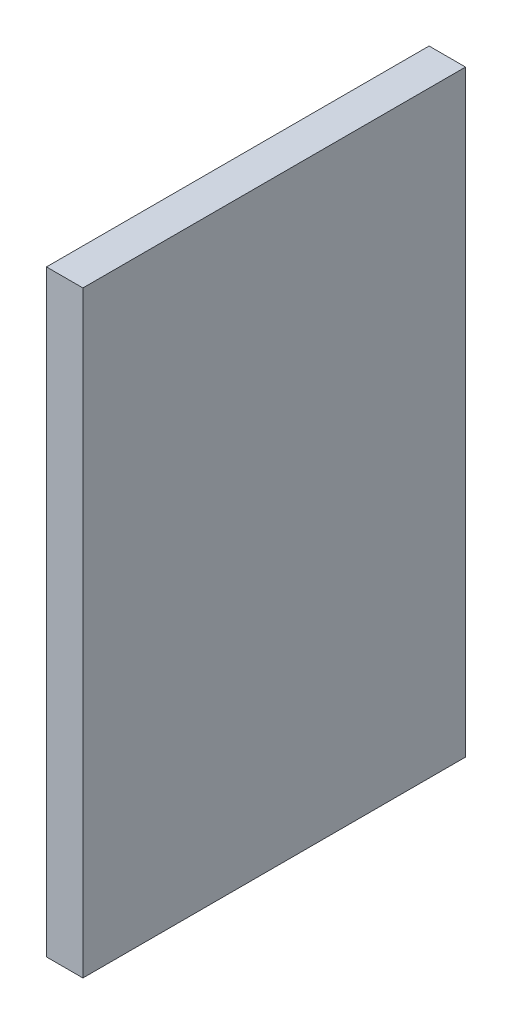
ISO-10303-21;
HEADER;
FILE_DESCRIPTION(('STEP AP214'),'2;1');
FILE_NAME('part.step','',(''),(''),'','','');
FILE_SCHEMA(('AUTOMOTIVE_DESIGN { 1 0 10303 214 1 1 1 1 }'));
ENDSEC;
DATA;
#1=APPLICATION_CONTEXT('core data for automotive mechanical design processes');
#2=APPLICATION_PROTOCOL_DEFINITION('international standard','automotive_design',2000,#1);
#3=PRODUCT_CONTEXT('',#1,'mechanical');
#4=PRODUCT('Part','Part','',(#3));
#5=PRODUCT_RELATED_PRODUCT_CATEGORY('part','',(#4));
#6=PRODUCT_DEFINITION_FORMATION('','',#4);
#7=PRODUCT_DEFINITION_CONTEXT('part definition',#1,'design');
#8=PRODUCT_DEFINITION('design','',#6,#7);
#9=PRODUCT_DEFINITION_SHAPE('','',#8);
#10=(LENGTH_UNIT() NAMED_UNIT(*) SI_UNIT(.MILLI.,.METRE.));
#11=(NAMED_UNIT(*) PLANE_ANGLE_UNIT() SI_UNIT($,.RADIAN.));
#12=(NAMED_UNIT(*) SI_UNIT($,.STERADIAN.) SOLID_ANGLE_UNIT());
#13=UNCERTAINTY_MEASURE_WITH_UNIT(LENGTH_MEASURE(1.E-05),#10,'distance_accuracy_value','');
#14=(GEOMETRIC_REPRESENTATION_CONTEXT(3) GLOBAL_UNCERTAINTY_ASSIGNED_CONTEXT((#13)) GLOBAL_UNIT_ASSIGNED_CONTEXT((#10,
#11,#12)) REPRESENTATION_CONTEXT('',''));
#15=CARTESIAN_POINT('',(0.,0.,0.));
#16=DIRECTION('',(0.,0.,1.));
#17=DIRECTION('',(1.,0.,0.));
#18=AXIS2_PLACEMENT_3D('',#15,#16,#17);
#19=CARTESIAN_POINT('',(-19.05,312.42,-187.325));
#20=DIRECTION('',(1.,0.,0.));
#21=DIRECTION('',(0.,0.,-1.));
#22=AXIS2_PLACEMENT_3D('',#19,#20,#21);
#23=PLANE('',#22);
#24=DIRECTION('',(0.,0.,1.));
#25=VECTOR('',#24,1.);
#26=CARTESIAN_POINT('',(-19.05,-312.42,-187.325));
#27=LINE('',#26,#25);
#28=CARTESIAN_POINT('',(-19.05,-312.42,-187.325));
#29=VERTEX_POINT('',#28);
#30=CARTESIAN_POINT('',(-19.05,-312.42,212.725));
#31=VERTEX_POINT('',#30);
#32=EDGE_CURVE('E113',#29,#31,#27,.T.);
#33=ORIENTED_EDGE('',*,*,#32,.T.);
#34=DIRECTION('',(0.,-1.,0.));
#35=VECTOR('',#34,1.);
#36=CARTESIAN_POINT('',(-19.05,312.42,212.725));
#37=LINE('',#36,#35);
#38=CARTESIAN_POINT('',(-19.05,312.42,212.725));
#39=VERTEX_POINT('',#38);
#40=EDGE_CURVE('E11',#39,#31,#37,.T.);
#41=ORIENTED_EDGE('',*,*,#40,.F.);
#42=DIRECTION('',(0.,0.,1.));
#43=VECTOR('',#42,1.);
#44=CARTESIAN_POINT('',(-19.05,312.42,-187.325));
#45=LINE('',#44,#43);
#46=CARTESIAN_POINT('',(-19.05,312.42,-187.325));
#47=VERTEX_POINT('',#46);
#48=EDGE_CURVE('E97',#47,#39,#45,.T.);
#49=ORIENTED_EDGE('',*,*,#48,.F.);
#50=DIRECTION('',(0.,-1.,0.));
#51=VECTOR('',#50,1.);
#52=CARTESIAN_POINT('',(-19.05,312.42,-187.325));
#53=LINE('',#52,#51);
#54=EDGE_CURVE('E109',#47,#29,#53,.T.);
#55=ORIENTED_EDGE('',*,*,#54,.T.);
#56=EDGE_LOOP('',(#33,#41,#49,#55));
#57=FACE_BOUND('',#56,.T.);
#58=ADVANCED_FACE('F45',(#57),#23,.F.);
#59=CARTESIAN_POINT('',(-19.05,312.42,212.725));
#60=DIRECTION('',(0.,0.,-1.));
#61=DIRECTION('',(-1.,0.,0.));
#62=AXIS2_PLACEMENT_3D('',#59,#60,#61);
#63=PLANE('',#62);
#64=DIRECTION('',(1.,0.,0.));
#65=VECTOR('',#64,1.);
#66=CARTESIAN_POINT('',(-19.05,-312.42,212.725));
#67=LINE('',#66,#65);
#68=CARTESIAN_POINT('',(19.05,-312.42,212.725));
#69=VERTEX_POINT('',#68);
#70=EDGE_CURVE('E102',#31,#69,#67,.T.);
#71=ORIENTED_EDGE('',*,*,#70,.T.);
#72=DIRECTION('',(0.,-1.,0.));
#73=VECTOR('',#72,1.);
#74=CARTESIAN_POINT('',(19.05,312.42,212.725));
#75=LINE('',#74,#73);
#76=CARTESIAN_POINT('',(19.05,312.42,212.725));
#77=VERTEX_POINT('',#76);
#78=EDGE_CURVE('E54',#77,#69,#75,.T.);
#79=ORIENTED_EDGE('',*,*,#78,.F.);
#80=DIRECTION('',(1.,0.,0.));
#81=VECTOR('',#80,1.);
#82=CARTESIAN_POINT('',(-19.05,312.42,212.725));
#83=LINE('',#82,#81);
#84=EDGE_CURVE('E92',#39,#77,#83,.T.);
#85=ORIENTED_EDGE('',*,*,#84,.F.);
#86=ORIENTED_EDGE('',*,*,#40,.T.);
#87=EDGE_LOOP('',(#71,#79,#85,#86));
#88=FACE_BOUND('',#87,.T.);
#89=ADVANCED_FACE('F101',(#88),#63,.F.);
#90=CARTESIAN_POINT('',(19.05,312.42,-187.325));
#91=DIRECTION('',(-1.,0.,0.));
#92=DIRECTION('',(0.,0.,1.));
#93=AXIS2_PLACEMENT_3D('',#90,#91,#92);
#94=PLANE('',#93);
#95=DIRECTION('',(0.,0.,-1.));
#96=VECTOR('',#95,1.);
#97=CARTESIAN_POINT('',(19.05,-312.42,-187.325));
#98=LINE('',#97,#96);
#99=CARTESIAN_POINT('',(19.05,-312.42,-187.325));
#100=VERTEX_POINT('',#99);
#101=EDGE_CURVE('E79',#69,#100,#98,.T.);
#102=ORIENTED_EDGE('',*,*,#101,.T.);
#103=DIRECTION('',(0.,-1.,0.));
#104=VECTOR('',#103,1.);
#105=CARTESIAN_POINT('',(19.05,312.42,-187.325));
#106=LINE('',#105,#104);
#107=CARTESIAN_POINT('',(19.05,312.42,-187.325));
#108=VERTEX_POINT('',#107);
#109=EDGE_CURVE('E104',#108,#100,#106,.T.);
#110=ORIENTED_EDGE('',*,*,#109,.F.);
#111=DIRECTION('',(0.,0.,-1.));
#112=VECTOR('',#111,1.);
#113=CARTESIAN_POINT('',(19.05,312.42,-187.325));
#114=LINE('',#113,#112);
#115=EDGE_CURVE('E95',#77,#108,#114,.T.);
#116=ORIENTED_EDGE('',*,*,#115,.F.);
#117=ORIENTED_EDGE('',*,*,#78,.T.);
#118=EDGE_LOOP('',(#102,#110,#116,#117));
#119=FACE_BOUND('',#118,.T.);
#120=ADVANCED_FACE('F105',(#119),#94,.F.);
#121=CARTESIAN_POINT('',(-19.05,312.42,-187.325));
#122=DIRECTION('',(0.,0.,1.));
#123=DIRECTION('',(1.,0.,0.));
#124=AXIS2_PLACEMENT_3D('',#121,#122,#123);
#125=PLANE('',#124);
#126=DIRECTION('',(-1.,0.,0.));
#127=VECTOR('',#126,1.);
#128=CARTESIAN_POINT('',(-19.05,-312.42,-187.325));
#129=LINE('',#128,#127);
#130=EDGE_CURVE('E85',#100,#29,#129,.T.);
#131=ORIENTED_EDGE('',*,*,#130,.T.);
#132=ORIENTED_EDGE('',*,*,#54,.F.);
#133=DIRECTION('',(-1.,0.,0.));
#134=VECTOR('',#133,1.);
#135=CARTESIAN_POINT('',(-19.05,312.42,-187.325));
#136=LINE('',#135,#134);
#137=EDGE_CURVE('E62',#108,#47,#136,.T.);
#138=ORIENTED_EDGE('',*,*,#137,.F.);
#139=ORIENTED_EDGE('',*,*,#109,.T.);
#140=EDGE_LOOP('',(#131,#132,#138,#139));
#141=FACE_BOUND('',#140,.T.);
#142=ADVANCED_FACE('F126',(#141),#125,.F.);
#143=CARTESIAN_POINT('',(0.,312.42,0.));
#144=DIRECTION('',(0.,1.,0.));
#145=DIRECTION('',(0.,0.,1.));
#146=AXIS2_PLACEMENT_3D('',#143,#144,#145);
#147=PLANE('',#146);
#148=ORIENTED_EDGE('',*,*,#48,.T.);
#149=ORIENTED_EDGE('',*,*,#84,.T.);
#150=ORIENTED_EDGE('',*,*,#115,.T.);
#151=ORIENTED_EDGE('',*,*,#137,.T.);
#152=EDGE_LOOP('',(#148,#149,#150,#151));
#153=FACE_BOUND('',#152,.T.);
#154=ADVANCED_FACE('F93',(#153),#147,.T.);
#155=CARTESIAN_POINT('',(0.,-312.42,0.));
#156=DIRECTION('',(0.,1.,0.));
#157=DIRECTION('',(0.,0.,1.));
#158=AXIS2_PLACEMENT_3D('',#155,#156,#157);
#159=PLANE('',#158);
#160=ORIENTED_EDGE('',*,*,#32,.F.);
#161=ORIENTED_EDGE('',*,*,#130,.F.);
#162=ORIENTED_EDGE('',*,*,#101,.F.);
#163=ORIENTED_EDGE('',*,*,#70,.F.);
#164=EDGE_LOOP('',(#160,#161,#162,#163));
#165=FACE_BOUND('',#164,.T.);
#166=ADVANCED_FACE('F129',(#165),#159,.F.);
#167=CLOSED_SHELL('',(#58,#89,#120,#142,#154,#166));
#168=MANIFOLD_SOLID_BREP('B2',#167);
#169=ADVANCED_BREP_SHAPE_REPRESENTATION('',(#18,#168),#14);
#170=SHAPE_DEFINITION_REPRESENTATION(#9,#169);
ENDSEC;
END-ISO-10303-21;
